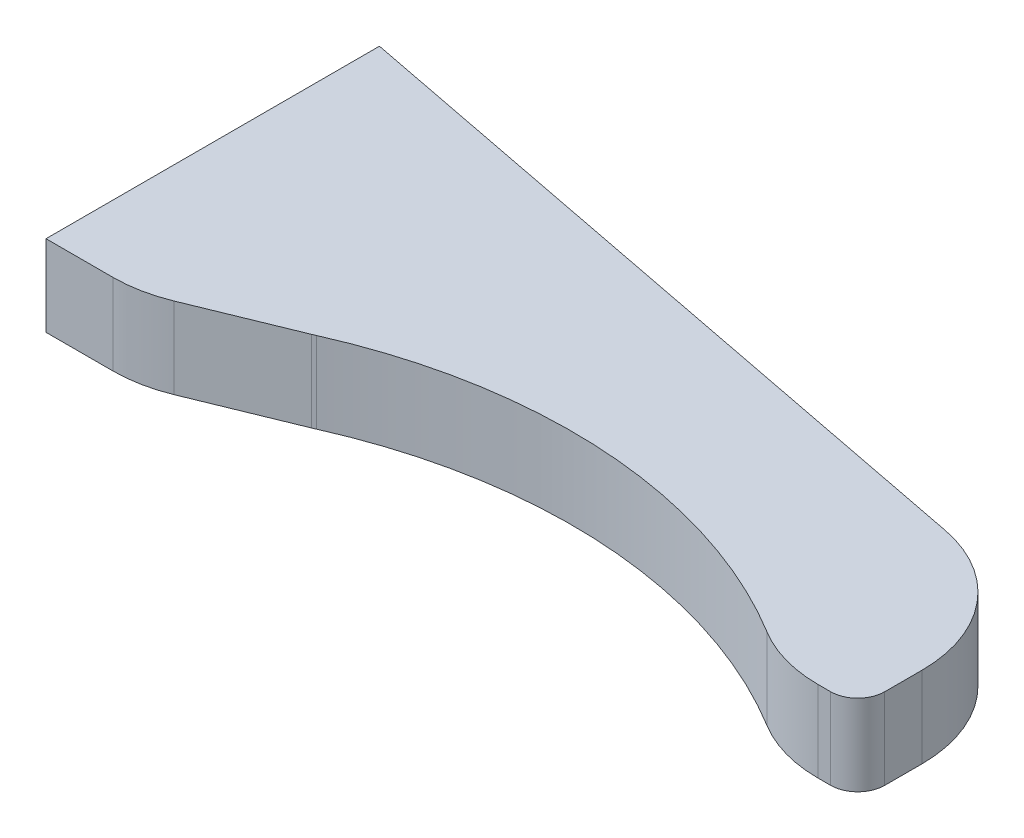
ISO-10303-21;
HEADER;
FILE_DESCRIPTION(('STEP AP214'),'2;1');
FILE_NAME('part.step','',(''),(''),'','','');
FILE_SCHEMA(('AUTOMOTIVE_DESIGN { 1 0 10303 214 1 1 1 1 }'));
ENDSEC;
DATA;
#1=APPLICATION_CONTEXT('core data for automotive mechanical design processes');
#2=APPLICATION_PROTOCOL_DEFINITION('international standard','automotive_design',2000,#1);
#3=PRODUCT_CONTEXT('',#1,'mechanical');
#4=PRODUCT('Part','Part','',(#3));
#5=PRODUCT_RELATED_PRODUCT_CATEGORY('part','',(#4));
#6=PRODUCT_DEFINITION_FORMATION('','',#4);
#7=PRODUCT_DEFINITION_CONTEXT('part definition',#1,'design');
#8=PRODUCT_DEFINITION('design','',#6,#7);
#9=PRODUCT_DEFINITION_SHAPE('','',#8);
#10=(LENGTH_UNIT() NAMED_UNIT(*) SI_UNIT(.MILLI.,.METRE.));
#11=(NAMED_UNIT(*) PLANE_ANGLE_UNIT() SI_UNIT($,.RADIAN.));
#12=(NAMED_UNIT(*) SI_UNIT($,.STERADIAN.) SOLID_ANGLE_UNIT());
#13=UNCERTAINTY_MEASURE_WITH_UNIT(LENGTH_MEASURE(1.E-05),#10,'distance_accuracy_value','');
#14=(GEOMETRIC_REPRESENTATION_CONTEXT(3) GLOBAL_UNCERTAINTY_ASSIGNED_CONTEXT((#13)) GLOBAL_UNIT_ASSIGNED_CONTEXT((#10,
#11,#12)) REPRESENTATION_CONTEXT('',''));
#15=CARTESIAN_POINT('',(0.,0.,0.));
#16=DIRECTION('',(0.,0.,1.));
#17=DIRECTION('',(1.,0.,0.));
#18=AXIS2_PLACEMENT_3D('',#15,#16,#17);
#19=CARTESIAN_POINT('',(20.,3.,6.5));
#20=DIRECTION('',(0.,0.,-1.));
#21=DIRECTION('',(-1.,0.,0.));
#22=AXIS2_PLACEMENT_3D('',#19,#20,#21);
#23=PLANE('',#22);
#24=DIRECTION('',(1.,0.,0.));
#25=VECTOR('',#24,1.);
#26=CARTESIAN_POINT('',(20.,3.,6.5));
#27=LINE('',#26,#25);
#28=CARTESIAN_POINT('',(-10.0206572268036,3.,6.5));
#29=VERTEX_POINT('',#28);
#30=CARTESIAN_POINT('',(-7.55139674607755,3.,6.5));
#31=VERTEX_POINT('',#30);
#32=EDGE_CURVE('E131',#29,#31,#27,.T.);
#33=ORIENTED_EDGE('',*,*,#32,.F.);
#34=DIRECTION('',(0.,-1.,0.));
#35=VECTOR('',#34,1.);
#36=CARTESIAN_POINT('',(-10.0206572268036,3.,6.5));
#37=LINE('',#36,#35);
#38=CARTESIAN_POINT('',(-10.0206572268036,0.,6.5));
#39=VERTEX_POINT('',#38);
#40=EDGE_CURVE('E120',#29,#39,#37,.T.);
#41=ORIENTED_EDGE('',*,*,#40,.T.);
#42=DIRECTION('',(1.,0.,0.));
#43=VECTOR('',#42,1.);
#44=CARTESIAN_POINT('',(20.,0.,6.5));
#45=LINE('',#44,#43);
#46=CARTESIAN_POINT('',(-7.55139674607755,0.,6.5));
#47=VERTEX_POINT('',#46);
#48=EDGE_CURVE('E150',#39,#47,#45,.T.);
#49=ORIENTED_EDGE('',*,*,#48,.T.);
#50=DIRECTION('',(0.,1.,0.));
#51=VECTOR('',#50,1.);
#52=CARTESIAN_POINT('',(-7.55139674607755,3.,6.5));
#53=LINE('',#52,#51);
#54=EDGE_CURVE('E138',#47,#31,#53,.T.);
#55=ORIENTED_EDGE('',*,*,#54,.T.);
#56=EDGE_LOOP('',(#33,#41,#49,#55));
#57=FACE_BOUND('',#56,.T.);
#58=ADVANCED_FACE('F33',(#57),#23,.F.);
#59=CARTESIAN_POINT('',(18.5241355014372,0.,6.5));
#60=VERTEX_POINT('',#59);
#61=CARTESIAN_POINT('',(19.,0.,6.5));
#62=VERTEX_POINT('',#61);
#63=EDGE_CURVE('E152',#60,#62,#45,.T.);
#64=ORIENTED_EDGE('',*,*,#63,.T.);
#65=DIRECTION('',(0.,-1.,0.));
#66=VECTOR('',#65,1.);
#67=CARTESIAN_POINT('',(19.,3.,6.5));
#68=LINE('',#67,#66);
#69=CARTESIAN_POINT('',(19.,3.,6.5));
#70=VERTEX_POINT('',#69);
#71=EDGE_CURVE('E192',#62,#70,#68,.F.);
#72=ORIENTED_EDGE('',*,*,#71,.T.);
#73=CARTESIAN_POINT('',(18.5241355014372,3.,6.5));
#74=VERTEX_POINT('',#73);
#75=EDGE_CURVE('E140',#74,#70,#27,.T.);
#76=ORIENTED_EDGE('',*,*,#75,.F.);
#77=DIRECTION('',(0.,1.,0.));
#78=VECTOR('',#77,1.);
#79=CARTESIAN_POINT('',(18.5241355014372,3.,6.5));
#80=LINE('',#79,#78);
#81=EDGE_CURVE('E172',#74,#60,#80,.F.);
#82=ORIENTED_EDGE('',*,*,#81,.T.);
#83=EDGE_LOOP('',(#64,#72,#76,#82));
#84=FACE_BOUND('',#83,.T.);
#85=ADVANCED_FACE('F220',(#84),#23,.F.);
#86=CARTESIAN_POINT('',(20.,3.,6.5));
#87=DIRECTION('',(-1.,0.,0.));
#88=DIRECTION('',(0.,0.,1.));
#89=AXIS2_PLACEMENT_3D('',#86,#87,#88);
#90=PLANE('',#89);
#91=DIRECTION('',(0.,0.,-1.));
#92=VECTOR('',#91,1.);
#93=CARTESIAN_POINT('',(20.,0.,6.5));
#94=LINE('',#93,#92);
#95=CARTESIAN_POINT('',(20.,0.,5.5));
#96=VERTEX_POINT('',#95);
#97=CARTESIAN_POINT('',(20.,0.,4.12211966353114));
#98=VERTEX_POINT('',#97);
#99=EDGE_CURVE('E146',#96,#98,#94,.T.);
#100=ORIENTED_EDGE('',*,*,#99,.T.);
#101=DIRECTION('',(0.,1.,0.));
#102=VECTOR('',#101,1.);
#103=CARTESIAN_POINT('',(20.,3.,4.12211966353114));
#104=LINE('',#103,#102);
#105=CARTESIAN_POINT('',(20.,3.,4.12211966353114));
#106=VERTEX_POINT('',#105);
#107=EDGE_CURVE('E196',#98,#106,#104,.T.);
#108=ORIENTED_EDGE('',*,*,#107,.T.);
#109=DIRECTION('',(0.,0.,-1.));
#110=VECTOR('',#109,1.);
#111=CARTESIAN_POINT('',(20.,3.,6.5));
#112=LINE('',#111,#110);
#113=CARTESIAN_POINT('',(20.,3.,5.5));
#114=VERTEX_POINT('',#113);
#115=EDGE_CURVE('E139',#114,#106,#112,.T.);
#116=ORIENTED_EDGE('',*,*,#115,.F.);
#117=DIRECTION('',(0.,-1.,0.));
#118=VECTOR('',#117,1.);
#119=CARTESIAN_POINT('',(20.,3.,5.5));
#120=LINE('',#119,#118);
#121=EDGE_CURVE('E187',#114,#96,#120,.T.);
#122=ORIENTED_EDGE('',*,*,#121,.T.);
#123=EDGE_LOOP('',(#100,#108,#116,#122));
#124=FACE_BOUND('',#123,.T.);
#125=ADVANCED_FACE('F209',(#124),#90,.F.);
#126=CARTESIAN_POINT('',(0.,3.,0.));
#127=DIRECTION('',(0.,1.,0.));
#128=DIRECTION('',(0.,0.,1.));
#129=AXIS2_PLACEMENT_3D('',#126,#127,#128);
#130=PLANE('',#129);
#131=DIRECTION('',(0.,0.,-1.));
#132=VECTOR('',#131,1.);
#133=CARTESIAN_POINT('',(-10.0206572268036,3.,-12.8793825533151));
#134=LINE('',#133,#132);
#135=CARTESIAN_POINT('',(-10.0206572268036,3.,-5.83217688364942));
#136=VERTEX_POINT('',#135);
#137=EDGE_CURVE('E48',#29,#136,#134,.T.);
#138=ORIENTED_EDGE('',*,*,#137,.F.);
#139=ORIENTED_EDGE('',*,*,#32,.T.);
#140=CARTESIAN_POINT('',(-7.55139674607755,3.,1.5));
#141=DIRECTION('',(0.,1.,0.));
#142=DIRECTION('',(0.,0.,1.));
#143=AXIS2_PLACEMENT_3D('',#140,#141,#142);
#144=CIRCLE('',#143,5.);
#145=CARTESIAN_POINT('',(-5.6607983761621,3.,6.12878362031247));
#146=VERTEX_POINT('',#145);
#147=EDGE_CURVE('E166',#31,#146,#144,.T.);
#148=ORIENTED_EDGE('',*,*,#147,.T.);
#149=DIRECTION('',(-0.925756724062495,0.,0.378119673983089));
#150=VECTOR('',#149,1.);
#151=CARTESIAN_POINT('',(-1.9772743993048,3.,4.62427077256766));
#152=LINE('',#151,#150);
#153=CARTESIAN_POINT('',(-2.04882570037994,3.,4.65349546403614));
#154=VERTEX_POINT('',#153);
#155=EDGE_CURVE('E223',#154,#146,#152,.T.);
#156=ORIENTED_EDGE('',*,*,#155,.F.);
#157=CARTESIAN_POINT('',(-3.93942407029539,3.,0.0247118437236676));
#158=DIRECTION('',(0.,1.,0.));
#159=DIRECTION('',(0.,0.,1.));
#160=AXIS2_PLACEMENT_3D('',#157,#158,#159);
#161=CIRCLE('',#160,5.);
#162=CARTESIAN_POINT('',(-1.91436117457624,3.,4.5962674070283));
#163=VERTEX_POINT('',#162);
#164=EDGE_CURVE('E168',#154,#163,#161,.T.);
#165=ORIENTED_EDGE('',*,*,#164,.T.);
#166=CARTESIAN_POINT('',(5.88433111463469,3.,22.2017231173716));
#167=DIRECTION('',(0.,1.,0.));
#168=DIRECTION('',(0.,0.,1.));
#169=AXIS2_PLACEMENT_3D('',#166,#167,#168);
#170=CIRCLE('',#169,19.2554322774291);
#171=CARTESIAN_POINT('',(15.9185739426427,3.,5.76744056353834));
#172=VERTEX_POINT('',#171);
#173=EDGE_CURVE('E126',#172,#163,#170,.T.);
#174=ORIENTED_EDGE('',*,*,#173,.F.);
#175=CARTESIAN_POINT('',(18.5241355014372,3.,1.5));
#176=DIRECTION('',(0.,1.,0.));
#177=DIRECTION('',(0.,0.,1.));
#178=AXIS2_PLACEMENT_3D('',#175,#176,#177);
#179=CIRCLE('',#178,5.);
#180=EDGE_CURVE('E170',#172,#74,#179,.T.);
#181=ORIENTED_EDGE('',*,*,#180,.T.);
#182=ORIENTED_EDGE('',*,*,#75,.T.);
#183=CARTESIAN_POINT('',(19.,3.,5.5));
#184=DIRECTION('',(0.,1.,0.));
#185=DIRECTION('',(0.,0.,1.));
#186=AXIS2_PLACEMENT_3D('',#183,#184,#185);
#187=CIRCLE('',#186,1.);
#188=EDGE_CURVE('E194',#70,#114,#187,.T.);
#189=ORIENTED_EDGE('',*,*,#188,.T.);
#190=ORIENTED_EDGE('',*,*,#115,.T.);
#191=CARTESIAN_POINT('',(15.,3.,4.12211966353114));
#192=DIRECTION('',(0.,1.,0.));
#193=DIRECTION('',(0.,0.,1.));
#194=AXIS2_PLACEMENT_3D('',#191,#192,#193);
#195=CIRCLE('',#194,5.);
#196=CARTESIAN_POINT('',(15.9535333125523,3.,-0.786115683500738));
#197=VERTEX_POINT('',#196);
#198=EDGE_CURVE('E199',#106,#197,#195,.T.);
#199=ORIENTED_EDGE('',*,*,#198,.T.);
#200=DIRECTION('',(0.981647069406375,0.,0.190706662510454));
#201=VECTOR('',#200,1.);
#202=CARTESIAN_POINT('',(-13.4582225243004,3.,-6.5));
#203=LINE('',#202,#201);
#204=EDGE_CURVE('E134',#136,#197,#203,.T.);
#205=ORIENTED_EDGE('',*,*,#204,.F.);
#206=EDGE_LOOP('',(#138,#139,#148,#156,#165,#174,#181,#182,#189,#190,#199,#205));
#207=FACE_BOUND('',#206,.T.);
#208=ADVANCED_FACE('F130',(#207),#130,.T.);
#209=CARTESIAN_POINT('',(0.,0.,0.));
#210=DIRECTION('',(0.,1.,0.));
#211=DIRECTION('',(0.,0.,1.));
#212=AXIS2_PLACEMENT_3D('',#209,#210,#211);
#213=PLANE('',#212);
#214=ORIENTED_EDGE('',*,*,#48,.F.);
#215=DIRECTION('',(0.,0.,-1.));
#216=VECTOR('',#215,1.);
#217=CARTESIAN_POINT('',(-10.0206572268036,0.,0.));
#218=LINE('',#217,#216);
#219=CARTESIAN_POINT('',(-10.0206572268036,0.,-5.83217688364942));
#220=VERTEX_POINT('',#219);
#221=EDGE_CURVE('E122',#39,#220,#218,.T.);
#222=ORIENTED_EDGE('',*,*,#221,.T.);
#223=DIRECTION('',(0.981647069406375,0.,0.190706662510454));
#224=VECTOR('',#223,1.);
#225=CARTESIAN_POINT('',(0.727380622517526,0.,-3.74413272739316));
#226=LINE('',#225,#224);
#227=CARTESIAN_POINT('',(15.9535333125523,0.,-0.786115683500739));
#228=VERTEX_POINT('',#227);
#229=EDGE_CURVE('E55',#220,#228,#226,.T.);
#230=ORIENTED_EDGE('',*,*,#229,.T.);
#231=CARTESIAN_POINT('',(15.,0.,4.12211966353114));
#232=DIRECTION('',(0.,1.,0.));
#233=DIRECTION('',(0.,0.,1.));
#234=AXIS2_PLACEMENT_3D('',#231,#232,#233);
#235=CIRCLE('',#234,5.);
#236=EDGE_CURVE('E41',#228,#98,#235,.F.);
#237=ORIENTED_EDGE('',*,*,#236,.T.);
#238=ORIENTED_EDGE('',*,*,#99,.F.);
#239=CARTESIAN_POINT('',(19.,0.,5.5));
#240=DIRECTION('',(0.,1.,0.));
#241=DIRECTION('',(0.,0.,1.));
#242=AXIS2_PLACEMENT_3D('',#239,#240,#241);
#243=CIRCLE('',#242,1.);
#244=EDGE_CURVE('E190',#96,#62,#243,.F.);
#245=ORIENTED_EDGE('',*,*,#244,.T.);
#246=ORIENTED_EDGE('',*,*,#63,.F.);
#247=CARTESIAN_POINT('',(18.5241355014372,0.,1.5));
#248=DIRECTION('',(0.,1.,0.));
#249=DIRECTION('',(0.,0.,1.));
#250=AXIS2_PLACEMENT_3D('',#247,#248,#249);
#251=CIRCLE('',#250,5.);
#252=CARTESIAN_POINT('',(15.9185739426427,0.,5.76744056353834));
#253=VERTEX_POINT('',#252);
#254=EDGE_CURVE('E179',#60,#253,#251,.F.);
#255=ORIENTED_EDGE('',*,*,#254,.T.);
#256=CARTESIAN_POINT('',(5.88433111463469,0.,22.2017231173716));
#257=DIRECTION('',(0.,1.,0.));
#258=DIRECTION('',(0.,0.,1.));
#259=AXIS2_PLACEMENT_3D('',#256,#257,#258);
#260=CIRCLE('',#259,19.2554322774291);
#261=CARTESIAN_POINT('',(-1.91436117457624,0.,4.5962674070283));
#262=VERTEX_POINT('',#261);
#263=EDGE_CURVE('E143',#253,#262,#260,.T.);
#264=ORIENTED_EDGE('',*,*,#263,.T.);
#265=CARTESIAN_POINT('',(-3.93942407029539,0.,0.0247118437236676));
#266=DIRECTION('',(0.,1.,0.));
#267=DIRECTION('',(0.,0.,1.));
#268=AXIS2_PLACEMENT_3D('',#265,#266,#267);
#269=CIRCLE('',#268,5.);
#270=CARTESIAN_POINT('',(-2.04882570037995,0.,4.65349546403614));
#271=VERTEX_POINT('',#270);
#272=EDGE_CURVE('E177',#262,#271,#269,.F.);
#273=ORIENTED_EDGE('',*,*,#272,.T.);
#274=DIRECTION('',(-0.925756724062495,0.,0.37811967398309));
#275=VECTOR('',#274,1.);
#276=CARTESIAN_POINT('',(1.33601153360486,0.,3.2709793902844));
#277=LINE('',#276,#275);
#278=CARTESIAN_POINT('',(-5.6607983761621,0.,6.12878362031248));
#279=VERTEX_POINT('',#278);
#280=EDGE_CURVE('E157',#271,#279,#277,.T.);
#281=ORIENTED_EDGE('',*,*,#280,.T.);
#282=CARTESIAN_POINT('',(-7.55139674607755,0.,1.5));
#283=DIRECTION('',(0.,1.,0.));
#284=DIRECTION('',(0.,0.,1.));
#285=AXIS2_PLACEMENT_3D('',#282,#283,#284);
#286=CIRCLE('',#285,5.);
#287=EDGE_CURVE('E174',#279,#47,#286,.F.);
#288=ORIENTED_EDGE('',*,*,#287,.T.);
#289=EDGE_LOOP('',(#214,#222,#230,#237,#238,#245,#246,#255,#264,#273,#281,#288));
#290=FACE_BOUND('',#289,.T.);
#291=ADVANCED_FACE('F204',(#290),#213,.F.);
#292=CARTESIAN_POINT('',(5.88433111463469,-7.,22.2017231173716));
#293=DIRECTION('',(0.,1.,0.));
#294=DIRECTION('',(0.,0.,1.));
#295=AXIS2_PLACEMENT_3D('',#292,#293,#294);
#296=CYLINDRICAL_SURFACE('',#295,19.2554322774291);
#297=ORIENTED_EDGE('',*,*,#263,.F.);
#298=DIRECTION('',(0.,1.,0.));
#299=VECTOR('',#298,1.);
#300=CARTESIAN_POINT('',(15.9185739426427,-7.,5.76744056353834));
#301=LINE('',#300,#299);
#302=EDGE_CURVE('E163',#253,#172,#301,.T.);
#303=ORIENTED_EDGE('',*,*,#302,.T.);
#304=ORIENTED_EDGE('',*,*,#173,.T.);
#305=DIRECTION('',(0.,1.,0.));
#306=VECTOR('',#305,1.);
#307=CARTESIAN_POINT('',(-1.91436117457624,-7.,4.5962674070283));
#308=LINE('',#307,#306);
#309=EDGE_CURVE('E161',#163,#262,#308,.F.);
#310=ORIENTED_EDGE('',*,*,#309,.T.);
#311=EDGE_LOOP('',(#297,#303,#304,#310));
#312=FACE_BOUND('',#311,.T.);
#313=ADVANCED_FACE('F244',(#312),#296,.F.);
#314=CARTESIAN_POINT('',(-1.9772743993048,-7.,4.62427077256766));
#315=DIRECTION('',(-0.378119673983089,0.,-0.925756724062495));
#316=DIRECTION('',(-0.925756724062495,0.,0.37811967398309));
#317=AXIS2_PLACEMENT_3D('',#314,#315,#316);
#318=PLANE('',#317);
#319=ORIENTED_EDGE('',*,*,#280,.F.);
#320=DIRECTION('',(0.,1.,0.));
#321=VECTOR('',#320,1.);
#322=CARTESIAN_POINT('',(-2.04882570037994,-7.,4.65349546403614));
#323=LINE('',#322,#321);
#324=EDGE_CURVE('E183',#271,#154,#323,.T.);
#325=ORIENTED_EDGE('',*,*,#324,.T.);
#326=ORIENTED_EDGE('',*,*,#155,.T.);
#327=DIRECTION('',(0.,1.,0.));
#328=VECTOR('',#327,1.);
#329=CARTESIAN_POINT('',(-5.6607983761621,-7.,6.12878362031247));
#330=LINE('',#329,#328);
#331=EDGE_CURVE('E181',#146,#279,#330,.F.);
#332=ORIENTED_EDGE('',*,*,#331,.T.);
#333=EDGE_LOOP('',(#319,#325,#326,#332));
#334=FACE_BOUND('',#333,.T.);
#335=ADVANCED_FACE('F235',(#334),#318,.F.);
#336=CARTESIAN_POINT('',(-13.4582225243004,-7.,-6.5));
#337=DIRECTION('',(-0.190706662510454,0.,0.981647069406375));
#338=DIRECTION('',(0.981647069406375,0.,0.190706662510454));
#339=AXIS2_PLACEMENT_3D('',#336,#337,#338);
#340=PLANE('',#339);
#341=ORIENTED_EDGE('',*,*,#229,.F.);
#342=DIRECTION('',(0.,1.,0.));
#343=VECTOR('',#342,1.);
#344=CARTESIAN_POINT('',(-10.0206572268036,-7.,-5.83217688364942));
#345=LINE('',#344,#343);
#346=EDGE_CURVE('E11',#220,#136,#345,.T.);
#347=ORIENTED_EDGE('',*,*,#346,.T.);
#348=ORIENTED_EDGE('',*,*,#204,.T.);
#349=DIRECTION('',(0.,1.,0.));
#350=VECTOR('',#349,1.);
#351=CARTESIAN_POINT('',(15.9535333125523,-7.,-0.786115683500741));
#352=LINE('',#351,#350);
#353=EDGE_CURVE('E201',#197,#228,#352,.F.);
#354=ORIENTED_EDGE('',*,*,#353,.T.);
#355=EDGE_LOOP('',(#341,#347,#348,#354));
#356=FACE_BOUND('',#355,.T.);
#357=ADVANCED_FACE('F232',(#356),#340,.F.);
#358=CARTESIAN_POINT('',(18.5241355014372,-7.,1.5));
#359=DIRECTION('',(0.,1.,0.));
#360=DIRECTION('',(0.,0.,1.));
#361=AXIS2_PLACEMENT_3D('',#358,#359,#360);
#362=CYLINDRICAL_SURFACE('',#361,5.);
#363=ORIENTED_EDGE('',*,*,#254,.F.);
#364=ORIENTED_EDGE('',*,*,#81,.F.);
#365=ORIENTED_EDGE('',*,*,#180,.F.);
#366=ORIENTED_EDGE('',*,*,#302,.F.);
#367=EDGE_LOOP('',(#363,#364,#365,#366));
#368=FACE_BOUND('',#367,.T.);
#369=ADVANCED_FACE('F234',(#368),#362,.T.);
#370=CARTESIAN_POINT('',(-3.93942407029539,-7.,0.0247118437236676));
#371=DIRECTION('',(0.,1.,0.));
#372=DIRECTION('',(0.,0.,1.));
#373=AXIS2_PLACEMENT_3D('',#370,#371,#372);
#374=CYLINDRICAL_SURFACE('',#373,5.);
#375=ORIENTED_EDGE('',*,*,#272,.F.);
#376=ORIENTED_EDGE('',*,*,#309,.F.);
#377=ORIENTED_EDGE('',*,*,#164,.F.);
#378=ORIENTED_EDGE('',*,*,#324,.F.);
#379=EDGE_LOOP('',(#375,#376,#377,#378));
#380=FACE_BOUND('',#379,.T.);
#381=ADVANCED_FACE('F241',(#380),#374,.T.);
#382=CARTESIAN_POINT('',(-7.55139674607755,3.,1.5));
#383=DIRECTION('',(0.,1.,0.));
#384=DIRECTION('',(0.,0.,1.));
#385=AXIS2_PLACEMENT_3D('',#382,#383,#384);
#386=CYLINDRICAL_SURFACE('',#385,5.);
#387=ORIENTED_EDGE('',*,*,#287,.F.);
#388=ORIENTED_EDGE('',*,*,#331,.F.);
#389=ORIENTED_EDGE('',*,*,#147,.F.);
#390=ORIENTED_EDGE('',*,*,#54,.F.);
#391=EDGE_LOOP('',(#387,#388,#389,#390));
#392=FACE_BOUND('',#391,.T.);
#393=ADVANCED_FACE('F257',(#392),#386,.T.);
#394=CARTESIAN_POINT('',(19.,3.,5.5));
#395=DIRECTION('',(0.,-1.,0.));
#396=DIRECTION('',(0.,0.,-1.));
#397=AXIS2_PLACEMENT_3D('',#394,#395,#396);
#398=CYLINDRICAL_SURFACE('',#397,1.);
#399=ORIENTED_EDGE('',*,*,#188,.F.);
#400=ORIENTED_EDGE('',*,*,#71,.F.);
#401=ORIENTED_EDGE('',*,*,#244,.F.);
#402=ORIENTED_EDGE('',*,*,#121,.F.);
#403=EDGE_LOOP('',(#399,#400,#401,#402));
#404=FACE_BOUND('',#403,.T.);
#405=ADVANCED_FACE('F214',(#404),#398,.T.);
#406=CARTESIAN_POINT('',(15.,3.,4.12211966353114));
#407=DIRECTION('',(0.,1.,0.));
#408=DIRECTION('',(0.,0.,1.));
#409=AXIS2_PLACEMENT_3D('',#406,#407,#408);
#410=CYLINDRICAL_SURFACE('',#409,5.);
#411=ORIENTED_EDGE('',*,*,#236,.F.);
#412=ORIENTED_EDGE('',*,*,#353,.F.);
#413=ORIENTED_EDGE('',*,*,#198,.F.);
#414=ORIENTED_EDGE('',*,*,#107,.F.);
#415=EDGE_LOOP('',(#411,#412,#413,#414));
#416=FACE_BOUND('',#415,.T.);
#417=ADVANCED_FACE('F35',(#416),#410,.T.);
#418=CARTESIAN_POINT('',(-10.0206572268036,-7.,-12.8793825533151));
#419=DIRECTION('',(1.,0.,0.));
#420=DIRECTION('',(0.,0.,-1.));
#421=AXIS2_PLACEMENT_3D('',#418,#419,#420);
#422=PLANE('',#421);
#423=ORIENTED_EDGE('',*,*,#137,.T.);
#424=ORIENTED_EDGE('',*,*,#346,.F.);
#425=ORIENTED_EDGE('',*,*,#221,.F.);
#426=ORIENTED_EDGE('',*,*,#40,.F.);
#427=EDGE_LOOP('',(#423,#424,#425,#426));
#428=FACE_BOUND('',#427,.T.);
#429=ADVANCED_FACE('F121',(#428),#422,.F.);
#430=CLOSED_SHELL('',(#58,#85,#125,#208,#291,#313,#335,#357,#369,#381,#393,#405,#417,#429));
#431=MANIFOLD_SOLID_BREP('B2',#430);
#432=ADVANCED_BREP_SHAPE_REPRESENTATION('',(#18,#431),#14);
#433=SHAPE_DEFINITION_REPRESENTATION(#9,#432);
ENDSEC;
END-ISO-10303-21;
